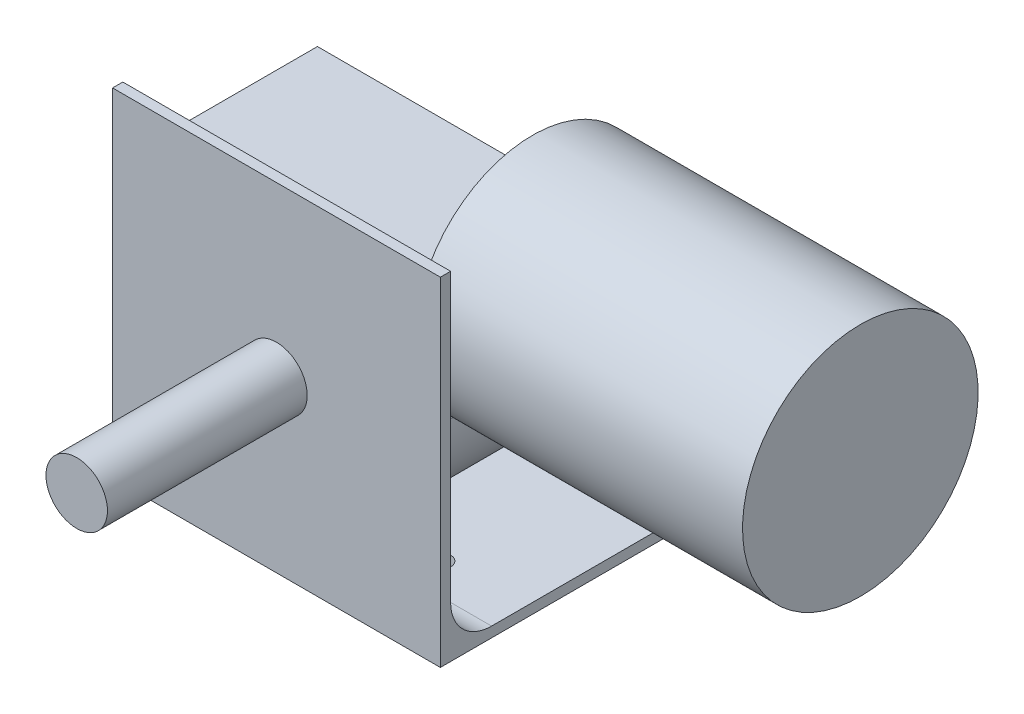
ISO-10303-21;
HEADER;
FILE_DESCRIPTION(('STEP AP214'),'2;1');
FILE_NAME('part.step','',(''),(''),'','','');
FILE_SCHEMA(('AUTOMOTIVE_DESIGN { 1 0 10303 214 1 1 1 1 }'));
ENDSEC;
DATA;
#1=APPLICATION_CONTEXT('core data for automotive mechanical design processes');
#2=APPLICATION_PROTOCOL_DEFINITION('international standard','automotive_design',2000,#1);
#3=PRODUCT_CONTEXT('',#1,'mechanical');
#4=PRODUCT('Part','Part','',(#3));
#5=PRODUCT_RELATED_PRODUCT_CATEGORY('part','',(#4));
#6=PRODUCT_DEFINITION_FORMATION('','',#4);
#7=PRODUCT_DEFINITION_CONTEXT('part definition',#1,'design');
#8=PRODUCT_DEFINITION('design','',#6,#7);
#9=PRODUCT_DEFINITION_SHAPE('','',#8);
#10=(LENGTH_UNIT() NAMED_UNIT(*) SI_UNIT(.MILLI.,.METRE.));
#11=(NAMED_UNIT(*) PLANE_ANGLE_UNIT() SI_UNIT($,.RADIAN.));
#12=(NAMED_UNIT(*) SI_UNIT($,.STERADIAN.) SOLID_ANGLE_UNIT());
#13=UNCERTAINTY_MEASURE_WITH_UNIT(LENGTH_MEASURE(1.E-05),#10,'distance_accuracy_value','');
#14=(GEOMETRIC_REPRESENTATION_CONTEXT(3) GLOBAL_UNCERTAINTY_ASSIGNED_CONTEXT((#13)) GLOBAL_UNIT_ASSIGNED_CONTEXT((#10,
#11,#12)) REPRESENTATION_CONTEXT('',''));
#15=CARTESIAN_POINT('',(0.,0.,0.));
#16=DIRECTION('',(0.,0.,1.));
#17=DIRECTION('',(1.,0.,0.));
#18=AXIS2_PLACEMENT_3D('',#15,#16,#17);
#19=CARTESIAN_POINT('',(38.1,52.3875,0.));
#20=DIRECTION('',(1.,0.,0.));
#21=DIRECTION('',(0.,1.,0.));
#22=AXIS2_PLACEMENT_3D('',#19,#20,#21);
#23=PLANE('',#22);
#24=DIRECTION('',(0.,0.,1.));
#25=VECTOR('',#24,1.);
#26=CARTESIAN_POINT('',(38.1,52.3875,0.));
#27=LINE('',#26,#25);
#28=CARTESIAN_POINT('',(38.1,52.3875,34.1184442484171));
#29=VERTEX_POINT('',#28);
#30=CARTESIAN_POINT('',(38.1,52.3875,47.625));
#31=VERTEX_POINT('',#30);
#32=EDGE_CURVE('E75',#29,#31,#27,.T.);
#33=ORIENTED_EDGE('',*,*,#32,.F.);
#34=CARTESIAN_POINT('',(38.1,79.375,9.52500000000001));
#35=DIRECTION('',(1.,0.,0.));
#36=DIRECTION('',(0.,1.,0.));
#37=AXIS2_PLACEMENT_3D('',#34,#35,#36);
#38=CIRCLE('',#37,36.5125);
#39=CARTESIAN_POINT('',(38.1,96.8375,41.5909281792996));
#40=VERTEX_POINT('',#39);
#41=EDGE_CURVE('E154',#40,#29,#38,.T.);
#42=ORIENTED_EDGE('',*,*,#41,.F.);
#43=DIRECTION('',(0.,0.,1.));
#44=VECTOR('',#43,1.);
#45=CARTESIAN_POINT('',(38.1,96.8375,0.));
#46=LINE('',#45,#44);
#47=CARTESIAN_POINT('',(38.1,96.8375,47.625));
#48=VERTEX_POINT('',#47);
#49=EDGE_CURVE('E183',#40,#48,#46,.T.);
#50=ORIENTED_EDGE('',*,*,#49,.T.);
#51=DIRECTION('',(0.,1.,0.));
#52=VECTOR('',#51,1.);
#53=CARTESIAN_POINT('',(38.1,52.3875,47.625));
#54=LINE('',#53,#52);
#55=EDGE_CURVE('E162',#31,#48,#54,.T.);
#56=ORIENTED_EDGE('',*,*,#55,.F.);
#57=EDGE_LOOP('',(#33,#42,#50,#56));
#58=FACE_BOUND('',#57,.T.);
#59=ADVANCED_FACE('F49',(#58),#23,.T.);
#60=CARTESIAN_POINT('',(-50.8,104.775,47.625));
#61=DIRECTION('',(0.,0.,1.));
#62=DIRECTION('',(1.,0.,0.));
#63=AXIS2_PLACEMENT_3D('',#60,#61,#62);
#64=PLANE('',#63);
#65=CARTESIAN_POINT('',(0.,52.3875,47.625));
#66=DIRECTION('',(0.,0.,-1.));
#67=DIRECTION('',(-1.,0.,0.));
#68=AXIS2_PLACEMENT_3D('',#65,#66,#67);
#69=CIRCLE('',#68,38.1);
#70=CARTESIAN_POINT('',(10.8833516781367,15.875,47.625));
#71=VERTEX_POINT('',#70);
#72=EDGE_CURVE('E173',#31,#71,#69,.T.);
#73=ORIENTED_EDGE('',*,*,#72,.F.);
#74=ORIENTED_EDGE('',*,*,#55,.T.);
#75=DIRECTION('',(-1.,0.,0.));
#76=VECTOR('',#75,1.);
#77=CARTESIAN_POINT('',(38.1,96.8375,47.625));
#78=LINE('',#77,#76);
#79=CARTESIAN_POINT('',(-38.1,96.8375,47.625));
#80=VERTEX_POINT('',#79);
#81=EDGE_CURVE('E187',#48,#80,#78,.T.);
#82=ORIENTED_EDGE('',*,*,#81,.T.);
#83=DIRECTION('',(0.,1.,0.));
#84=VECTOR('',#83,1.);
#85=CARTESIAN_POINT('',(-38.1,52.3875,47.625));
#86=LINE('',#85,#84);
#87=CARTESIAN_POINT('',(-38.1,52.3875,47.625));
#88=VERTEX_POINT('',#87);
#89=EDGE_CURVE('E184',#88,#80,#86,.T.);
#90=ORIENTED_EDGE('',*,*,#89,.F.);
#91=CARTESIAN_POINT('',(-10.8833516781366,15.875,47.625));
#92=VERTEX_POINT('',#91);
#93=EDGE_CURVE('E194',#92,#88,#69,.T.);
#94=ORIENTED_EDGE('',*,*,#93,.F.);
#95=DIRECTION('',(-1.,0.,0.));
#96=VECTOR('',#95,1.);
#97=CARTESIAN_POINT('',(-50.8,15.875,47.625));
#98=LINE('',#97,#96);
#99=CARTESIAN_POINT('',(-50.8,15.875,47.625));
#100=VERTEX_POINT('',#99);
#101=EDGE_CURVE('E259',#92,#100,#98,.T.);
#102=ORIENTED_EDGE('',*,*,#101,.T.);
#103=DIRECTION('',(0.,-1.,0.));
#104=VECTOR('',#103,1.);
#105=CARTESIAN_POINT('',(-50.8,104.775,47.625));
#106=LINE('',#105,#104);
#107=CARTESIAN_POINT('',(-50.8,104.775,47.625));
#108=VERTEX_POINT('',#107);
#109=EDGE_CURVE('E231',#108,#100,#106,.T.);
#110=ORIENTED_EDGE('',*,*,#109,.F.);
#111=DIRECTION('',(-1.,0.,0.));
#112=VECTOR('',#111,1.);
#113=CARTESIAN_POINT('',(-50.8,104.775,47.625));
#114=LINE('',#113,#112);
#115=CARTESIAN_POINT('',(50.8,104.775,47.625));
#116=VERTEX_POINT('',#115);
#117=EDGE_CURVE('E229',#116,#108,#114,.T.);
#118=ORIENTED_EDGE('',*,*,#117,.F.);
#119=DIRECTION('',(0.,-1.,0.));
#120=VECTOR('',#119,1.);
#121=CARTESIAN_POINT('',(50.8,104.775,47.625));
#122=LINE('',#121,#120);
#123=CARTESIAN_POINT('',(50.8,15.875,47.625));
#124=VERTEX_POINT('',#123);
#125=EDGE_CURVE('E247',#116,#124,#122,.T.);
#126=ORIENTED_EDGE('',*,*,#125,.T.);
#127=EDGE_CURVE('E255',#124,#71,#98,.T.);
#128=ORIENTED_EDGE('',*,*,#127,.T.);
#129=EDGE_LOOP('',(#73,#74,#82,#90,#94,#102,#110,#118,#126,#128));
#130=FACE_BOUND('',#129,.T.);
#131=ADVANCED_FACE('F282',(#130),#64,.F.);
#132=CARTESIAN_POINT('',(-50.8,15.875,34.925));
#133=DIRECTION('',(-1.,0.,0.));
#134=DIRECTION('',(0.,0.,1.));
#135=AXIS2_PLACEMENT_3D('',#132,#133,#134);
#136=CYLINDRICAL_SURFACE('',#135,12.7);
#137=CARTESIAN_POINT('',(10.8833516781367,15.875,47.625));
#138=CARTESIAN_POINT('',(10.3730525428204,15.7228946163432,47.6250016366047));
#139=CARTESIAN_POINT('',(9.85953509828765,15.5814803263617,47.6222802820452));
#140=CARTESIAN_POINT('',(8.8269947183021,15.3202931065714,47.6135526113099));
#141=CARTESIAN_POINT('',(8.30797097151665,15.2005234142494,47.6075458042533));
#142=CARTESIAN_POINT('',(7.26509560923538,14.9827907398067,47.5940911343711));
#143=CARTESIAN_POINT('',(6.7412415672725,14.8848394180847,47.586642504947));
#144=CARTESIAN_POINT('',(5.68990770627986,14.7109977258499,47.5718458416427));
#145=CARTESIAN_POINT('',(5.16242803695867,14.6351064499741,47.564497803646));
#146=CARTESIAN_POINT('',(4.10347894465887,14.5053579899575,47.5510978591837));
#147=CARTESIAN_POINT('',(3.57200302976457,14.4515534378577,47.5450490649297));
#148=CARTESIAN_POINT('',(2.5072325732708,14.3663343574066,47.5351455046628));
#149=CARTESIAN_POINT('',(1.97393801337232,14.3349200550155,47.5312907607921));
#150=CARTESIAN_POINT('',(0.906599596275883,14.2945449275413,47.52629264782));
#151=CARTESIAN_POINT('',(0.372555922025923,14.2855793407752,47.5251487037232));
#152=CARTESIAN_POINT('',(-0.695432963041855,14.2901047146811,47.5257187076317));
#153=CARTESIAN_POINT('',(-1.22937817416053,14.3035956055596,47.5274326467548));
#154=CARTESIAN_POINT('',(-2.29691666349038,14.3530410041654,47.5334995639886));
#155=CARTESIAN_POINT('',(-2.83050855212299,14.3890250725765,47.5378560146822));
#156=CARTESIAN_POINT('',(-3.89568552753107,14.4834169125394,47.5486187762102));
#157=CARTESIAN_POINT('',(-4.42727060643122,14.5418247719967,47.5550250950806));
#158=CARTESIAN_POINT('',(-5.48761251512766,14.6809741171146,47.5689388711745));
#159=CARTESIAN_POINT('',(-6.01636870172657,14.7617204787607,47.5764465686355));
#160=CARTESIAN_POINT('',(-7.07001300902832,14.9453994811022,47.5912674107498));
#161=CARTESIAN_POINT('',(-7.59490115271145,15.0483319898782,47.5985805565596));
#162=CARTESIAN_POINT('',(-8.63954456099684,15.2761289086062,47.6113847091505));
#163=CARTESIAN_POINT('',(-9.15930309499015,15.40097824861,47.6168769605256));
#164=CARTESIAN_POINT('',(-10.1931507672481,15.6724442274982,47.6241104730915));
#165=CARTESIAN_POINT('',(-10.7072397417456,15.8190614933963,47.6258516262115));
#166=CARTESIAN_POINT('',(-11.7285837846019,16.1337315724601,47.6233388131038));
#167=CARTESIAN_POINT('',(-12.235841556336,16.3017756130999,47.6190872932669));
#168=CARTESIAN_POINT('',(-13.2426638993691,16.6589795622064,47.6020394438277));
#169=CARTESIAN_POINT('',(-13.7422292392319,16.8481373453806,47.5892439736079));
#170=CARTESIAN_POINT('',(-14.8658341301256,17.3008103806973,47.5472740423023));
#171=CARTESIAN_POINT('',(-15.4872230661125,17.5706429692637,47.5146205046702));
#172=CARTESIAN_POINT('',(-16.7133018432464,18.1423110462305,47.4243211924508));
#173=CARTESIAN_POINT('',(-17.317992085383,18.4441457653129,47.3666760185496));
#174=CARTESIAN_POINT('',(-18.5064646498756,19.0772424273994,47.2189476554986));
#175=CARTESIAN_POINT('',(-19.0902809995024,19.4084530978861,47.1289201782385));
#176=CARTESIAN_POINT('',(-20.2339582174904,20.0975327343201,46.9079498934892));
#177=CARTESIAN_POINT('',(-20.7938279453918,20.4553917044973,46.7770223693032));
#178=CARTESIAN_POINT('',(-21.7172937948834,21.0797082223941,46.5128364924578));
#179=CARTESIAN_POINT('',(-22.0884338345003,21.3405461009487,46.3926025725637));
#180=CARTESIAN_POINT('',(-22.8147980060793,21.8703428417145,46.1247312945663));
#181=CARTESIAN_POINT('',(-23.1700225169978,22.1393015103101,45.9770945893677));
#182=CARTESIAN_POINT('',(-23.8618461705317,22.682021972767,45.6513466429108));
#183=CARTESIAN_POINT('',(-24.1984627352639,22.9557789465313,45.4732645689894));
#184=CARTESIAN_POINT('',(-24.8507197223003,23.504405608862,45.0835089705245));
#185=CARTESIAN_POINT('',(-25.1663658135775,23.7792749752221,44.8718445771827));
#186=CARTESIAN_POINT('',(-25.7038371749709,24.2623911305154,44.4652885423789));
#187=CARTESIAN_POINT('',(-25.9305367039214,24.4714125468909,44.2777469576156));
#188=CARTESIAN_POINT('',(-26.368341258711,24.8845711871538,43.8804298162096));
#189=CARTESIAN_POINT('',(-26.5794497735499,25.0887094968406,43.6706592597672));
#190=CARTESIAN_POINT('',(-26.9845090850279,25.4890367775657,43.2285627249006));
#191=CARTESIAN_POINT('',(-27.1784722876557,25.685231439818,42.996253314704));
#192=CARTESIAN_POINT('',(-27.5479675860322,26.0665964675476,42.5089975738468));
#193=CARTESIAN_POINT('',(-27.7235022135489,26.2517683458477,42.2540543615852));
#194=CARTESIAN_POINT('',(-28.0301502542058,26.5812301066569,41.7617294351516));
#195=CARTESIAN_POINT('',(-28.1639882475115,26.7275056143007,41.527369707858));
#196=CARTESIAN_POINT('',(-28.4165439314505,27.0074769643903,41.043500585764));
#197=CARTESIAN_POINT('',(-28.5352642253795,27.1411749716663,40.7939938102708));
#198=CARTESIAN_POINT('',(-28.7569092291271,27.3939319068551,40.2809295540399));
#199=CARTESIAN_POINT('',(-28.8598343521675,27.5129912177187,40.0173724411199));
#200=CARTESIAN_POINT('',(-29.0493028062014,27.7345231446831,39.4776687090642));
#201=CARTESIAN_POINT('',(-29.1358458526025,27.8369954726275,39.2015218713209));
#202=CARTESIAN_POINT('',(-29.2923896505595,28.0239851013214,38.6372588409612));
#203=CARTESIAN_POINT('',(-29.3623190829347,28.1084248402163,38.3490970724196));
#204=CARTESIAN_POINT('',(-29.4847795081061,28.2572889904582,37.7640197719495));
#205=CARTESIAN_POINT('',(-29.5373102703151,28.3217131365349,37.4671041240614));
#206=CARTESIAN_POINT('',(-29.6246876047836,28.429355251988,36.8669319411584));
#207=CARTESIAN_POINT('',(-29.6595367220296,28.4725762731813,36.5636763252254));
#208=CARTESIAN_POINT('',(-29.7113815698908,28.5370171946115,35.9533328318951));
#209=CARTESIAN_POINT('',(-29.7283785268348,28.5582386060793,35.646245219198));
#210=CARTESIAN_POINT('',(-29.7438142139887,28.5775097704797,35.0548417420662));
#211=CARTESIAN_POINT('',(-29.7435941186308,28.577234108641,34.7706133403252));
#212=CARTESIAN_POINT('',(-29.7279068604518,28.5576507435448,34.2032468062718));
#213=CARTESIAN_POINT('',(-29.7124406144488,28.538344184699,33.9201086094284));
#214=CARTESIAN_POINT('',(-29.6663328152946,28.4810146199157,33.3570514022969));
#215=CARTESIAN_POINT('',(-29.6356946781381,28.4429958271031,33.0771316818693));
#216=CARTESIAN_POINT('',(-29.5593773114501,28.348846167681,32.522438985901));
#217=CARTESIAN_POINT('',(-29.5136979440895,28.2927151351016,32.2476660575468));
#218=CARTESIAN_POINT('',(-29.4081810516941,28.1640463098143,31.7086125884212));
#219=CARTESIAN_POINT('',(-29.3485316129668,28.091726995788,31.4442429047399));
#220=CARTESIAN_POINT('',(-29.2150431075463,27.93137339036,30.9240061207932));
#221=CARTESIAN_POINT('',(-29.1412043300546,27.8433394192508,30.6681388473596));
#222=CARTESIAN_POINT('',(-28.9796781947985,27.6528313076042,30.166353634413));
#223=CARTESIAN_POINT('',(-28.8919905906859,27.5503569101983,29.9204358719835));
#224=CARTESIAN_POINT('',(-28.7031843995679,27.3324010291058,29.4397829042502));
#225=CARTESIAN_POINT('',(-28.6020652653354,27.2169190154924,29.205048155094));
#226=CARTESIAN_POINT('',(-28.3807346376528,26.9675621176647,28.7346926341535));
#227=CARTESIAN_POINT('',(-28.2597624240299,26.833013356279,28.4997874144165));
#228=CARTESIAN_POINT('',(-28.0040142102013,26.5530049564194,28.0444727875199));
#229=CARTESIAN_POINT('',(-27.8692380631154,26.407545201852,27.8240635346452));
#230=CARTESIAN_POINT('',(-27.5865607428826,26.1075812907935,27.3982393879794));
#231=CARTESIAN_POINT('',(-27.4386559550049,25.9530746474175,27.1928286523059));
#232=CARTESIAN_POINT('',(-27.1305092816455,25.6369067345854,26.7973119921943));
#233=CARTESIAN_POINT('',(-26.9702649428988,25.4752440451435,26.6072091266105));
#234=CARTESIAN_POINT('',(-26.5685840103988,25.077609753077,26.1658102745895));
#235=CARTESIAN_POINT('',(-26.3212779427126,24.8389044504871,25.9222812082784));
#236=CARTESIAN_POINT('',(-25.8056928248145,24.3553532129654,25.4653821394871));
#237=CARTESIAN_POINT('',(-25.5374068029808,24.1105052553488,25.252022228899));
#238=CARTESIAN_POINT('',(-24.9817291236716,23.6184001772561,24.8537487052443));
#239=CARTESIAN_POINT('',(-24.6943099371872,23.3711400422389,24.6688774065285));
#240=CARTESIAN_POINT('',(-24.1028550710235,22.8779965538643,24.3260263824997));
#241=CARTESIAN_POINT('',(-23.7988188944759,22.6321132419183,24.1680474618836));
#242=CARTESIAN_POINT('',(-23.0353345728784,22.0343713972232,23.8109460149007));
#243=CARTESIAN_POINT('',(-22.5676992394588,21.6847917016249,23.6254539430874));
#244=CARTESIAN_POINT('',(-21.6064165641853,21.000857412258,23.2991981086429));
#245=CARTESIAN_POINT('',(-21.1127572459644,20.6665099627442,23.1584551530049));
#246=CARTESIAN_POINT('',(-20.102808441344,20.0170152020197,22.9144102745402));
#247=CARTESIAN_POINT('',(-19.5864783330365,19.7019049935422,22.8111789129952));
#248=CARTESIAN_POINT('',(-18.5354879121502,19.0946463311703,22.6358271224434));
#249=CARTESIAN_POINT('',(-18.0008279846067,18.8024973953765,22.5637060403674));
#250=CARTESIAN_POINT('',(-17.0354995494527,18.3048313004175,22.4576203711614));
#251=CARTESIAN_POINT('',(-16.6078686286682,18.0944073540089,22.4187501564876));
#252=CARTESIAN_POINT('',(-15.7441773195879,17.6893966644892,22.3536019246121));
#253=CARTESIAN_POINT('',(-15.3081159821937,17.4948117175367,22.3273253338933));
#254=CARTESIAN_POINT('',(-14.4283819904912,17.1219336833544,22.2849693264922));
#255=CARTESIAN_POINT('',(-13.9847059612757,16.9436480538471,22.2688945578452));
#256=CARTESIAN_POINT('',(-13.090789575051,16.6038464341503,22.2447873677833));
#257=CARTESIAN_POINT('',(-12.6405494244422,16.4423299179688,22.2367546940458));
#258=CARTESIAN_POINT('',(-11.733980457512,16.1362553987126,22.2267637383886));
#259=CARTESIAN_POINT('',(-11.2776481306725,15.9917076888995,22.2248091252803));
#260=CARTESIAN_POINT('',(-10.3598656028629,15.7199088729438,22.225219876473));
#261=CARTESIAN_POINT('',(-9.89841537430601,15.5926578600836,22.2275852640712));
#262=CARTESIAN_POINT('',(-8.97115328493669,15.3556574072211,22.2350694313573));
#263=CARTESIAN_POINT('',(-8.50534220425057,15.245904897887,22.2401877274799));
#264=CARTESIAN_POINT('',(-7.5699340567917,15.0440261746347,22.2518115877848));
#265=CARTESIAN_POINT('',(-7.100336978788,14.9519000130243,22.2583171560839));
#266=CARTESIAN_POINT('',(-6.13923498503407,14.7820838875485,22.2718153349685));
#267=CARTESIAN_POINT('',(-5.64760259144798,14.705115250178,22.2788170235669));
#268=CARTESIAN_POINT('',(-4.66168743444022,14.5704904531646,22.2919944438696));
#269=CARTESIAN_POINT('',(-4.16740465602381,14.5128344029015,22.2981701708959));
#270=CARTESIAN_POINT('',(-3.17692237308303,14.4169227634852,22.3088856593051));
#271=CARTESIAN_POINT('',(-2.68072279520333,14.3786679243724,22.3134253574382));
#272=CARTESIAN_POINT('',(-1.68719109902325,14.3216232151093,22.3203244085103));
#273=CARTESIAN_POINT('',(-1.18985898234729,14.3028333170578,22.3226837645746));
#274=CARTESIAN_POINT('',(-0.194602302821954,14.2847447092116,22.3249535037186));
#275=CARTESIAN_POINT('',(0.303322428201127,14.2854551004184,22.324862743302));
#276=CARTESIAN_POINT('',(1.29875362675905,14.3063882813755,22.3222396698089));
#277=CARTESIAN_POINT('',(1.79626009519026,14.3266110292024,22.3197073619783));
#278=CARTESIAN_POINT('',(2.79007543755734,14.3865356776971,22.3124909480213));
#279=CARTESIAN_POINT('',(3.28638432906831,14.4262372907331,22.3078068736686));
#280=CARTESIAN_POINT('',(4.27705063494961,14.525056313805,22.2968521202755));
#281=CARTESIAN_POINT('',(4.77140802683799,14.5841739468634,22.2905814230104));
#282=CARTESIAN_POINT('',(5.79369595483374,14.7267954292664,22.2767929819547));
#283=CARTESIAN_POINT('',(6.32142063318491,14.8117734367116,22.2692174325338));
#284=CARTESIAN_POINT('',(7.37284203927316,15.0038564361455,22.254546917231));
#285=CARTESIAN_POINT('',(7.89653869403408,15.1109618280438,22.2474519600381));
#286=CARTESIAN_POINT('',(8.93917336218515,15.3471571852422,22.2354227879585));
#287=CARTESIAN_POINT('',(9.45810963033803,15.4762548985173,22.2304893367737));
#288=CARTESIAN_POINT('',(10.4901079082341,15.7561817994467,22.2247842770524));
#289=CARTESIAN_POINT('',(11.0031700059996,15.9070106610066,22.2240126060716));
#290=CARTESIAN_POINT('',(12.021592031571,16.2298427905444,22.2289335395517));
#291=CARTESIAN_POINT('',(12.5269637342619,16.4018090278118,22.2346149787401));
#292=CARTESIAN_POINT('',(13.5299158056275,16.7667734620013,22.2550296664939));
#293=CARTESIAN_POINT('',(14.0274957627658,16.9597727655697,22.2697633915311));
#294=CARTESIAN_POINT('',(15.0133391956646,17.3661682974446,22.311193736664));
#295=CARTESIAN_POINT('',(15.5016093372109,17.5795492200846,22.3378814345809));
#296=CARTESIAN_POINT('',(16.4678324986146,18.0261310729564,22.4064672199232));
#297=CARTESIAN_POINT('',(16.9457874179778,18.2593283143629,22.448362481177));
#298=CARTESIAN_POINT('',(17.9056542576693,18.7527222195507,22.5526759110462));
#299=CARTESIAN_POINT('',(18.3871704128844,19.0135583559743,22.615729463649));
#300=CARTESIAN_POINT('',(19.3356682334525,19.5539840242579,22.7663095281666));
#301=CARTESIAN_POINT('',(19.8026508871498,19.8335722767909,22.8538343718629));
#302=CARTESIAN_POINT('',(20.7192215521623,20.4091268621025,23.0580357632112));
#303=CARTESIAN_POINT('',(21.1688276982473,20.7050752910489,23.1746809160514));
#304=CARTESIAN_POINT('',(22.0482321516221,21.310656564396,23.4422661309816));
#305=CARTESIAN_POINT('',(22.4780346243223,21.6202865040044,23.5931989411954));
#306=CARTESIAN_POINT('',(23.2262370387537,22.1828215531666,23.8986193059496));
#307=CARTESIAN_POINT('',(23.5490276000714,22.4339316293092,24.0456562965478));
#308=CARTESIAN_POINT('',(24.1781937961098,22.9394493876776,24.3669117288334));
#309=CARTESIAN_POINT('',(24.4845696428252,23.1938570272629,24.5411298193653));
#310=CARTESIAN_POINT('',(25.0783699118616,23.7023470035338,24.9188602837643));
#311=CARTESIAN_POINT('',(25.3658146692235,23.9564293920099,25.1223404517156));
#312=CARTESIAN_POINT('',(25.9196960301918,24.4604621198608,25.5606376774733));
#313=CARTESIAN_POINT('',(26.1861381019554,24.7104135212762,25.7954465355407));
#314=CARTESIAN_POINT('',(26.6385753307131,25.146503644106,26.2414767588601));
#315=CARTESIAN_POINT('',(26.8292403866832,25.3344181140296,26.4462394233598));
#316=CARTESIAN_POINT('',(27.1952200986937,25.7023490410468,26.8755842486569));
#317=CARTESIAN_POINT('',(27.3705382287168,25.882367280931,27.1001619008341));
#318=CARTESIAN_POINT('',(27.7046910901647,26.231839756285,27.5689596085419));
#319=CARTESIAN_POINT('',(27.8635269100309,26.4012946890279,27.813178365141));
#320=CARTESIAN_POINT('',(28.1636440040991,26.7268649490747,28.320616237994));
#321=CARTESIAN_POINT('',(28.3049249584295,26.8829800332937,28.5838357003265));
#322=CARTESIAN_POINT('',(28.5699166712127,27.1801634421962,29.1301174444217));
#323=CARTESIAN_POINT('',(28.6934895363206,27.3211117507401,29.413312260537));
#324=CARTESIAN_POINT('',(28.9209343819008,27.5838756506844,29.9960671429888));
#325=CARTESIAN_POINT('',(29.0248058740115,27.7056907677946,30.2956276147636));
#326=CARTESIAN_POINT('',(29.2120844181671,27.9276302918257,30.908739083989));
#327=CARTESIAN_POINT('',(29.2954990270548,28.0277627068065,31.2222848644791));
#328=CARTESIAN_POINT('',(29.4413428078611,28.2042315015768,31.8607394748225));
#329=CARTESIAN_POINT('',(29.5037748625836,28.280571150162,32.1856467369383));
#330=CARTESIAN_POINT('',(29.6008898872263,28.3999518978036,32.8032105594058));
#331=CARTESIAN_POINT('',(29.6380421595838,28.445934595615,33.094915740574));
#332=CARTESIAN_POINT('',(29.6957348391736,28.5175301115257,33.6824310953872));
#333=CARTESIAN_POINT('',(29.7162767510368,28.543144774637,33.9782408947503));
#334=CARTESIAN_POINT('',(29.7406505546787,28.5735527444408,34.5715064449592));
#335=CARTESIAN_POINT('',(29.7444883731782,28.5783534360631,34.8689615745182));
#336=CARTESIAN_POINT('',(29.7354526071589,28.5670693981819,35.4632199995237));
#337=CARTESIAN_POINT('',(29.7225793760821,28.5509851103998,35.7600233086233));
#338=CARTESIAN_POINT('',(29.6814274982395,28.4997655636252,36.3332588973246));
#339=CARTESIAN_POINT('',(29.6540962546571,28.4658024685544,36.6098653336873));
#340=CARTESIAN_POINT('',(29.584796658873,28.3801503222416,37.1584447003581));
#341=CARTESIAN_POINT('',(29.5428290986455,28.3284622301055,37.4304178805375));
#342=CARTESIAN_POINT('',(29.4444437429485,28.2081542696775,37.9678829848321));
#343=CARTESIAN_POINT('',(29.3880277355125,28.1395364965169,38.2333757064714));
#344=CARTESIAN_POINT('',(29.2609933252545,27.9863902480016,38.7562458063395));
#345=CARTESIAN_POINT('',(29.1903745392569,27.9018613433855,39.0136229654024));
#346=CARTESIAN_POINT('',(29.0338163270977,27.7164137601009,39.5234633470638));
#347=CARTESIAN_POINT('',(28.9476163933362,27.6152195013747,39.775746156812));
#348=CARTESIAN_POINT('',(28.7612421548644,27.3990766745457,40.2689840230046));
#349=CARTESIAN_POINT('',(28.6610678247168,27.2841280814065,40.5099390588284));
#350=CARTESIAN_POINT('',(28.4472315347753,27.04206475466,40.9794559869076));
#351=CARTESIAN_POINT('',(28.3335679463638,26.914948552363,41.2080163778395));
#352=CARTESIAN_POINT('',(28.093323267471,26.6502286794142,41.6519045424191));
#353=CARTESIAN_POINT('',(27.9667406362438,26.5126237583575,41.8672307328167));
#354=CARTESIAN_POINT('',(27.6892494191156,26.2157521670548,42.302974078685));
#355=CARTESIAN_POINT('',(27.5371758033065,26.0556527733662,42.5220816913677));
#356=CARTESIAN_POINT('',(27.2192979748345,25.7271913978017,42.9434603874971));
#357=CARTESIAN_POINT('',(27.0534932908903,25.5588291324064,43.1457308925783));
#358=CARTESIAN_POINT('',(26.7090327140247,25.2158857042777,43.533417198451));
#359=CARTESIAN_POINT('',(26.5303743032902,25.041303326536,43.7188296808704));
#360=CARTESIAN_POINT('',(26.1611496878074,24.6878675896366,44.0730044834517));
#361=CARTESIAN_POINT('',(25.9705811208454,24.5090133875958,44.2417634834006));
#362=CARTESIAN_POINT('',(25.4739878269713,24.052854606499,44.6486567507258));
#363=CARTESIAN_POINT('',(25.1605260099212,23.7738471669051,44.875872599013));
#364=CARTESIAN_POINT('',(24.5109195230426,23.2154495938409,45.2946548151243));
#365=CARTESIAN_POINT('',(24.1747650239051,22.9360593465593,45.4862055979051));
#366=CARTESIAN_POINT('',(23.4819427639785,22.3807351308049,45.8370821847944));
#367=CARTESIAN_POINT('',(23.1252287369425,22.1048108064916,45.9963313484465));
#368=CARTESIAN_POINT('',(22.3946038069693,21.5605758321606,46.285422066114));
#369=CARTESIAN_POINT('',(22.0206932586072,21.2922650253441,46.4152642261454));
#370=CARTESIAN_POINT('',(21.3485135028371,20.8284139081035,46.6212340382754));
#371=CARTESIAN_POINT('',(21.053363511291,20.630721334339,46.702795511582));
#372=CARTESIAN_POINT('',(20.4552032049999,20.2421747161279,46.8523256154622));
#373=CARTESIAN_POINT('',(20.1521919965037,20.0513214551769,46.9202926927539));
#374=CARTESIAN_POINT('',(19.2322783590717,19.4900060315912,47.1060247393363));
#375=CARTESIAN_POINT('',(18.6046670957143,19.1309066431334,47.2055700581647));
#376=CARTESIAN_POINT('',(17.3264891135262,18.4474266732266,47.3666978547813));
#377=CARTESIAN_POINT('',(16.6759238357174,18.1230439174529,47.4282827112085));
#378=CARTESIAN_POINT('',(15.3558846555011,17.511495822965,47.5229194716809));
#379=CARTESIAN_POINT('',(14.6864181754162,17.2243161158866,47.5559824193939));
#380=CARTESIAN_POINT('',(13.4962320913766,16.7537245797192,47.5961944624635));
#381=CARTESIAN_POINT('',(12.9788918804242,16.5620535250864,47.6076879307275));
#382=CARTESIAN_POINT('',(12.197142461252,16.2915765784174,47.6184857667799));
#383=CARTESIAN_POINT('',(11.9356890069573,16.2042815649759,47.6210115431653));
#384=CARTESIAN_POINT('',(11.4108953675509,16.0353684458814,47.6242683896675));
#385=CARTESIAN_POINT('',(11.147554867299,15.9537513140228,47.6249991526614));
#386=CARTESIAN_POINT('',(10.8833516781367,15.875,47.625));
#387=B_SPLINE_CURVE_WITH_KNOTS('',3,(#137,#138,#139,#140,#141,#142,#143,#144,#145,#146,#147,
#148,#149,#150,#151,#152,#153,#154,#155,#156,#157,#158,#159,#160,#161,#162,#163,#164,#165,#166,
#167,#168,#169,#170,#171,#172,#173,#174,#175,#176,#177,#178,#179,#180,#181,#182,#183,#184,#185,
#186,#187,#188,#189,#190,#191,#192,#193,#194,#195,#196,#197,#198,#199,#200,#201,#202,#203,#204,
#205,#206,#207,#208,#209,#210,#211,#212,#213,#214,#215,#216,#217,#218,#219,#220,#221,#222,#223,
#224,#225,#226,#227,#228,#229,#230,#231,#232,#233,#234,#235,#236,#237,#238,#239,#240,#241,#242,
#243,#244,#245,#246,#247,#248,#249,#250,#251,#252,#253,#254,#255,#256,#257,#258,#259,#260,#261,
#262,#263,#264,#265,#266,#267,#268,#269,#270,#271,#272,#273,#274,#275,#276,#277,#278,#279,#280,
#281,#282,#283,#284,#285,#286,#287,#288,#289,#290,#291,#292,#293,#294,#295,#296,#297,#298,#299,
#300,#301,#302,#303,#304,#305,#306,#307,#308,#309,#310,#311,#312,#313,#314,#315,#316,#317,#318,
#319,#320,#321,#322,#323,#324,#325,#326,#327,#328,#329,#330,#331,#332,#333,#334,#335,#336,#337,
#338,#339,#340,#341,#342,#343,#344,#345,#346,#347,#348,#349,#350,#351,#352,#353,#354,#355,#356,
#357,#358,#359,#360,#361,#362,#363,#364,#365,#366,#367,#368,#369,#370,#371,#372,#373,#374,#375,
#376,#377,#378,#379,#380,#381,#382,#383,#384,#385,#386),.UNSPECIFIED.,.T.,.F.,(4,2,2,2,2,2,2,2,
2,2,2,2,2,2,2,2,2,2,2,2,2,2,2,2,2,2,2,2,2,2,2,2,2,2,2,2,2,2,2,2,2,2,2,2,2,2,2,2,2,2,2,2,2,2,2,2,
2,2,2,2,2,2,2,2,2,2,2,2,2,2,2,2,2,2,2,2,2,2,2,2,2,2,2,2,2,2,2,2,2,2,2,2,2,2,2,2,2,2,2,2,2,2,2,2,
2,2,2,2,2,2,2,2,2,2,2,2,2,2,2,2,2,2,2,2,4),(0.,1.59739237906854,3.19502349041154,
4.79350638655653,6.39192367034837,7.99412813028952,9.59634875928367,11.1982295063295,
12.8001052748361,14.4040906780435,16.0080823692419,17.6124244518494,19.2167569952551,
20.8199906946269,22.4232705832776,24.0258961540169,25.6283605509768,27.6617226730794,
29.6950359250575,31.7248675807259,33.753941645611,35.1608488638051,36.5677225650277,
37.9732559264354,39.3784077691468,40.4601874434449,41.5417242959384,42.6224720531157,
43.7030711393774,44.6230564550166,45.5428831326282,46.4626857423001,47.3825043294761,
48.306202927043,49.2299137660384,50.1534916140709,51.0770060140785,51.9286579793894,
52.7802587342346,53.631667835844,54.4830847394857,55.3236380740114,56.164174278524,
57.0047254365042,57.8453108507028,58.7339200305247,59.6225386665381,60.5114027308583,
61.4004439715827,62.6622849803825,63.9245470944203,65.1886663507436,66.4528234264857,
68.28777773388,70.1235839963335,71.9628258461865,73.8020290846696,75.2360735615535,
76.6702804346464,78.1051402761532,79.5399550972079,80.9756358267217,82.4113242986703,
83.8467606654145,85.2822012918715,86.7748274586594,88.2674620790244,89.7601543994431,
91.2528445802133,92.7462314278997,94.2396150669645,95.7329766548609,97.2263553968876,
98.8296059170872,100.432885415464,102.036730927634,103.640552375257,105.241603087428,
106.842738078941,108.442680005193,110.042324750548,111.695095924149,113.34775445509,
114.998638879984,116.6491744656,117.951917770242,119.254644246003,120.555947757711,
121.856911341584,122.867089187021,123.877037770615,124.886919617786,125.896819863564,
126.914200425839,127.931606203856,128.948635580663,129.965525170102,130.85727991192,
131.748953866081,132.64031142273,133.531650127303,134.370733214955,135.209770906686,
136.048704815414,136.887661360711,137.742220843338,138.596781881512,139.451446199769,
140.306212566042,141.238504091982,142.170827629541,143.103334292291,144.036026495322,
145.465445578544,146.895487835733,148.328884385574,149.762251393461,150.855290158981,
151.948453742745,154.13542107278,156.322251351411,158.508234509979,160.163103509381,
160.989998833262,161.817035627341),.UNSPECIFIED.);
#388=EDGE_CURVE('E12',#71,#92,#387,.T.);
#389=ORIENTED_EDGE('',*,*,#388,.F.);
#390=ORIENTED_EDGE('',*,*,#127,.F.);
#391=CARTESIAN_POINT('',(50.8,15.875,34.925));
#392=DIRECTION('',(-1.,0.,0.));
#393=DIRECTION('',(0.,0.,1.));
#394=AXIS2_PLACEMENT_3D('',#391,#392,#393);
#395=CIRCLE('',#394,12.7);
#396=CARTESIAN_POINT('',(50.8,3.175,34.925));
#397=VERTEX_POINT('',#396);
#398=EDGE_CURVE('E265',#397,#124,#395,.T.);
#399=ORIENTED_EDGE('',*,*,#398,.F.);
#400=DIRECTION('',(-1.,0.,0.));
#401=VECTOR('',#400,1.);
#402=CARTESIAN_POINT('',(-50.8,3.175,34.925));
#403=LINE('',#402,#401);
#404=CARTESIAN_POINT('',(-50.8,3.175,34.925));
#405=VERTEX_POINT('',#404);
#406=EDGE_CURVE('E258',#405,#397,#403,.F.);
#407=ORIENTED_EDGE('',*,*,#406,.F.);
#408=CARTESIAN_POINT('',(-50.8,15.875,34.925));
#409=DIRECTION('',(1.,0.,0.));
#410=DIRECTION('',(0.,0.,-1.));
#411=AXIS2_PLACEMENT_3D('',#408,#409,#410);
#412=CIRCLE('',#411,12.7);
#413=EDGE_CURVE('E263',#100,#405,#412,.T.);
#414=ORIENTED_EDGE('',*,*,#413,.F.);
#415=ORIENTED_EDGE('',*,*,#101,.F.);
#416=EDGE_LOOP('',(#389,#390,#399,#407,#414,#415));
#417=FACE_BOUND('',#416,.T.);
#418=ADVANCED_FACE('F51',(#417),#136,.F.);
#419=CARTESIAN_POINT('',(-50.8,3.175,50.8));
#420=DIRECTION('',(0.,0.,-1.));
#421=DIRECTION('',(-1.,0.,0.));
#422=AXIS2_PLACEMENT_3D('',#419,#420,#421);
#423=PLANE('',#422);
#424=DIRECTION('',(1.,0.,0.));
#425=VECTOR('',#424,1.);
#426=CARTESIAN_POINT('',(-50.8,0.,50.8));
#427=LINE('',#426,#425);
#428=CARTESIAN_POINT('',(-50.8,0.,50.8));
#429=VERTEX_POINT('',#428);
#430=CARTESIAN_POINT('',(50.8,0.,50.8));
#431=VERTEX_POINT('',#430);
#432=EDGE_CURVE('E358',#429,#431,#427,.T.);
#433=ORIENTED_EDGE('',*,*,#432,.T.);
#434=DIRECTION('',(0.,-1.,0.));
#435=VECTOR('',#434,1.);
#436=CARTESIAN_POINT('',(50.8,3.175,50.8));
#437=LINE('',#436,#435);
#438=CARTESIAN_POINT('',(50.8,104.775,50.8));
#439=VERTEX_POINT('',#438);
#440=EDGE_CURVE('E355',#439,#431,#437,.T.);
#441=ORIENTED_EDGE('',*,*,#440,.F.);
#442=DIRECTION('',(1.,0.,0.));
#443=VECTOR('',#442,1.);
#444=CARTESIAN_POINT('',(-50.8,104.775,50.8));
#445=LINE('',#444,#443);
#446=CARTESIAN_POINT('',(-50.8,104.775,50.8));
#447=VERTEX_POINT('',#446);
#448=EDGE_CURVE('E224',#447,#439,#445,.T.);
#449=ORIENTED_EDGE('',*,*,#448,.F.);
#450=DIRECTION('',(0.,-1.,0.));
#451=VECTOR('',#450,1.);
#452=CARTESIAN_POINT('',(-50.8,3.175,50.8));
#453=LINE('',#452,#451);
#454=EDGE_CURVE('E243',#447,#429,#453,.T.);
#455=ORIENTED_EDGE('',*,*,#454,.T.);
#456=EDGE_LOOP('',(#433,#441,#449,#455));
#457=FACE_BOUND('',#456,.T.);
#458=CARTESIAN_POINT('',(0.,52.3875,50.8));
#459=DIRECTION('',(0.,0.,-1.));
#460=DIRECTION('',(-1.,0.,0.));
#461=AXIS2_PLACEMENT_3D('',#458,#459,#460);
#462=CIRCLE('',#461,9.525);
#463=CARTESIAN_POINT('',(-9.525,52.3875,50.8));
#464=VERTEX_POINT('',#463);
#465=EDGE_CURVE('E61',#464,#464,#462,.F.);
#466=ORIENTED_EDGE('',*,*,#465,.F.);
#467=EDGE_LOOP('',(#466));
#468=FACE_BOUND('',#467,.T.);
#469=ADVANCED_FACE('F271',(#457,#468),#423,.F.);
#470=CARTESIAN_POINT('',(-50.8,3.175,-50.8));
#471=DIRECTION('',(1.,0.,0.));
#472=DIRECTION('',(0.,0.,-1.));
#473=AXIS2_PLACEMENT_3D('',#470,#471,#472);
#474=PLANE('',#473);
#475=DIRECTION('',(0.,0.,1.));
#476=VECTOR('',#475,1.);
#477=CARTESIAN_POINT('',(-50.8,0.,-50.8));
#478=LINE('',#477,#476);
#479=CARTESIAN_POINT('',(-50.8,0.,-50.8));
#480=VERTEX_POINT('',#479);
#481=EDGE_CURVE('E252',#480,#429,#478,.T.);
#482=ORIENTED_EDGE('',*,*,#481,.T.);
#483=ORIENTED_EDGE('',*,*,#454,.F.);
#484=DIRECTION('',(0.,0.,1.));
#485=VECTOR('',#484,1.);
#486=CARTESIAN_POINT('',(-50.8,104.775,50.8));
#487=LINE('',#486,#485);
#488=EDGE_CURVE('E221',#108,#447,#487,.T.);
#489=ORIENTED_EDGE('',*,*,#488,.F.);
#490=ORIENTED_EDGE('',*,*,#109,.T.);
#491=ORIENTED_EDGE('',*,*,#413,.T.);
#492=DIRECTION('',(0.,0.,1.));
#493=VECTOR('',#492,1.);
#494=CARTESIAN_POINT('',(-50.8,3.175,-50.8));
#495=LINE('',#494,#493);
#496=CARTESIAN_POINT('',(-50.8,3.175,-50.8));
#497=VERTEX_POINT('',#496);
#498=EDGE_CURVE('E237',#497,#405,#495,.T.);
#499=ORIENTED_EDGE('',*,*,#498,.F.);
#500=DIRECTION('',(0.,-1.,0.));
#501=VECTOR('',#500,1.);
#502=CARTESIAN_POINT('',(-50.8,3.175,-50.8));
#503=LINE('',#502,#501);
#504=EDGE_CURVE('E362',#497,#480,#503,.T.);
#505=ORIENTED_EDGE('',*,*,#504,.T.);
#506=EDGE_LOOP('',(#482,#483,#489,#490,#491,#499,#505));
#507=FACE_BOUND('',#506,.T.);
#508=ADVANCED_FACE('F273',(#507),#474,.F.);
#509=CARTESIAN_POINT('',(50.8,3.175,-50.8));
#510=DIRECTION('',(-1.,0.,0.));
#511=DIRECTION('',(0.,0.,1.));
#512=AXIS2_PLACEMENT_3D('',#509,#510,#511);
#513=PLANE('',#512);
#514=DIRECTION('',(0.,0.,-1.));
#515=VECTOR('',#514,1.);
#516=CARTESIAN_POINT('',(50.8,0.,-50.8));
#517=LINE('',#516,#515);
#518=CARTESIAN_POINT('',(50.8,0.,-50.8));
#519=VERTEX_POINT('',#518);
#520=EDGE_CURVE('E349',#431,#519,#517,.T.);
#521=ORIENTED_EDGE('',*,*,#520,.T.);
#522=DIRECTION('',(0.,-1.,0.));
#523=VECTOR('',#522,1.);
#524=CARTESIAN_POINT('',(50.8,3.175,-50.8));
#525=LINE('',#524,#523);
#526=CARTESIAN_POINT('',(50.8,3.175,-50.8));
#527=VERTEX_POINT('',#526);
#528=EDGE_CURVE('E352',#527,#519,#525,.T.);
#529=ORIENTED_EDGE('',*,*,#528,.F.);
#530=DIRECTION('',(0.,0.,-1.));
#531=VECTOR('',#530,1.);
#532=CARTESIAN_POINT('',(50.8,3.175,-50.8));
#533=LINE('',#532,#531);
#534=EDGE_CURVE('E241',#397,#527,#533,.T.);
#535=ORIENTED_EDGE('',*,*,#534,.F.);
#536=ORIENTED_EDGE('',*,*,#398,.T.);
#537=ORIENTED_EDGE('',*,*,#125,.F.);
#538=DIRECTION('',(0.,0.,-1.));
#539=VECTOR('',#538,1.);
#540=CARTESIAN_POINT('',(50.8,104.775,50.8));
#541=LINE('',#540,#539);
#542=EDGE_CURVE('E227',#439,#116,#541,.T.);
#543=ORIENTED_EDGE('',*,*,#542,.F.);
#544=ORIENTED_EDGE('',*,*,#440,.T.);
#545=EDGE_LOOP('',(#521,#529,#535,#536,#537,#543,#544));
#546=FACE_BOUND('',#545,.T.);
#547=ADVANCED_FACE('F280',(#546),#513,.F.);
#548=CARTESIAN_POINT('',(-50.8,3.175,-50.8));
#549=DIRECTION('',(0.,0.,1.));
#550=DIRECTION('',(1.,0.,0.));
#551=AXIS2_PLACEMENT_3D('',#548,#549,#550);
#552=PLANE('',#551);
#553=DIRECTION('',(-1.,0.,0.));
#554=VECTOR('',#553,1.);
#555=CARTESIAN_POINT('',(-50.8,0.,-50.8));
#556=LINE('',#555,#554);
#557=EDGE_CURVE('E242',#519,#480,#556,.T.);
#558=ORIENTED_EDGE('',*,*,#557,.T.);
#559=ORIENTED_EDGE('',*,*,#504,.F.);
#560=DIRECTION('',(-1.,0.,0.));
#561=VECTOR('',#560,1.);
#562=CARTESIAN_POINT('',(-50.8,3.175,-50.8));
#563=LINE('',#562,#561);
#564=EDGE_CURVE('E261',#527,#497,#563,.T.);
#565=ORIENTED_EDGE('',*,*,#564,.F.);
#566=ORIENTED_EDGE('',*,*,#528,.T.);
#567=EDGE_LOOP('',(#558,#559,#565,#566));
#568=FACE_BOUND('',#567,.T.);
#569=ADVANCED_FACE('F335',(#568),#552,.F.);
#570=CARTESIAN_POINT('',(-50.8,3.175,50.8));
#571=DIRECTION('',(0.,1.,0.));
#572=DIRECTION('',(0.,0.,1.));
#573=AXIS2_PLACEMENT_3D('',#570,#571,#572);
#574=PLANE('',#573);
#575=CARTESIAN_POINT('',(25.4,3.175,25.4));
#576=DIRECTION('',(0.,1.,0.));
#577=DIRECTION('',(0.,0.,1.));
#578=AXIS2_PLACEMENT_3D('',#575,#576,#577);
#579=CIRCLE('',#578,3.175);
#580=CARTESIAN_POINT('',(25.4,3.175,28.575));
#581=VERTEX_POINT('',#580);
#582=EDGE_CURVE('E170',#581,#581,#579,.T.);
#583=ORIENTED_EDGE('',*,*,#582,.F.);
#584=EDGE_LOOP('',(#583));
#585=FACE_BOUND('',#584,.T.);
#586=CARTESIAN_POINT('',(-25.4,3.175,25.4));
#587=DIRECTION('',(0.,1.,0.));
#588=DIRECTION('',(0.,0.,1.));
#589=AXIS2_PLACEMENT_3D('',#586,#587,#588);
#590=CIRCLE('',#589,3.175);
#591=CARTESIAN_POINT('',(-25.4,3.175,28.575));
#592=VERTEX_POINT('',#591);
#593=EDGE_CURVE('E200',#592,#592,#590,.T.);
#594=ORIENTED_EDGE('',*,*,#593,.F.);
#595=EDGE_LOOP('',(#594));
#596=FACE_BOUND('',#595,.T.);
#597=CARTESIAN_POINT('',(-25.4,3.175,-25.4));
#598=DIRECTION('',(0.,1.,0.));
#599=DIRECTION('',(0.,0.,1.));
#600=AXIS2_PLACEMENT_3D('',#597,#598,#599);
#601=CIRCLE('',#600,3.175);
#602=CARTESIAN_POINT('',(-25.4,3.175,-22.225));
#603=VERTEX_POINT('',#602);
#604=EDGE_CURVE('E206',#603,#603,#601,.T.);
#605=ORIENTED_EDGE('',*,*,#604,.F.);
#606=EDGE_LOOP('',(#605));
#607=FACE_BOUND('',#606,.T.);
#608=CARTESIAN_POINT('',(25.4,3.175,-25.4));
#609=DIRECTION('',(0.,1.,0.));
#610=DIRECTION('',(0.,0.,1.));
#611=AXIS2_PLACEMENT_3D('',#608,#609,#610);
#612=CIRCLE('',#611,3.175);
#613=CARTESIAN_POINT('',(25.4,3.175,-22.225));
#614=VERTEX_POINT('',#613);
#615=EDGE_CURVE('E212',#614,#614,#612,.T.);
#616=ORIENTED_EDGE('',*,*,#615,.F.);
#617=EDGE_LOOP('',(#616));
#618=FACE_BOUND('',#617,.T.);
#619=ORIENTED_EDGE('',*,*,#498,.T.);
#620=ORIENTED_EDGE('',*,*,#406,.T.);
#621=ORIENTED_EDGE('',*,*,#534,.T.);
#622=ORIENTED_EDGE('',*,*,#564,.T.);
#623=EDGE_LOOP('',(#619,#620,#621,#622));
#624=FACE_BOUND('',#623,.T.);
#625=ADVANCED_FACE('F332',(#585,#596,#607,#618,#624),#574,.T.);
#626=CARTESIAN_POINT('',(-50.8,0.,50.8));
#627=DIRECTION('',(0.,1.,0.));
#628=DIRECTION('',(0.,0.,1.));
#629=AXIS2_PLACEMENT_3D('',#626,#627,#628);
#630=PLANE('',#629);
#631=CARTESIAN_POINT('',(25.4,0.,25.4));
#632=DIRECTION('',(0.,1.,0.));
#633=DIRECTION('',(0.,0.,1.));
#634=AXIS2_PLACEMENT_3D('',#631,#632,#633);
#635=CIRCLE('',#634,3.175);
#636=CARTESIAN_POINT('',(25.4,0.,28.575));
#637=VERTEX_POINT('',#636);
#638=EDGE_CURVE('E197',#637,#637,#635,.T.);
#639=ORIENTED_EDGE('',*,*,#638,.T.);
#640=EDGE_LOOP('',(#639));
#641=FACE_BOUND('',#640,.T.);
#642=CARTESIAN_POINT('',(-25.4,0.,25.4));
#643=DIRECTION('',(0.,1.,0.));
#644=DIRECTION('',(0.,0.,1.));
#645=AXIS2_PLACEMENT_3D('',#642,#643,#644);
#646=CIRCLE('',#645,3.175);
#647=CARTESIAN_POINT('',(-25.4,0.,28.575));
#648=VERTEX_POINT('',#647);
#649=EDGE_CURVE('E203',#648,#648,#646,.T.);
#650=ORIENTED_EDGE('',*,*,#649,.T.);
#651=EDGE_LOOP('',(#650));
#652=FACE_BOUND('',#651,.T.);
#653=CARTESIAN_POINT('',(-25.4,0.,-25.4));
#654=DIRECTION('',(0.,1.,0.));
#655=DIRECTION('',(0.,0.,1.));
#656=AXIS2_PLACEMENT_3D('',#653,#654,#655);
#657=CIRCLE('',#656,3.175);
#658=CARTESIAN_POINT('',(-25.4,0.,-22.225));
#659=VERTEX_POINT('',#658);
#660=EDGE_CURVE('E209',#659,#659,#657,.T.);
#661=ORIENTED_EDGE('',*,*,#660,.T.);
#662=EDGE_LOOP('',(#661));
#663=FACE_BOUND('',#662,.T.);
#664=CARTESIAN_POINT('',(25.4,0.,-25.4));
#665=DIRECTION('',(0.,1.,0.));
#666=DIRECTION('',(0.,0.,1.));
#667=AXIS2_PLACEMENT_3D('',#664,#665,#666);
#668=CIRCLE('',#667,3.175);
#669=CARTESIAN_POINT('',(25.4,0.,-22.225));
#670=VERTEX_POINT('',#669);
#671=EDGE_CURVE('E215',#670,#670,#668,.T.);
#672=ORIENTED_EDGE('',*,*,#671,.T.);
#673=EDGE_LOOP('',(#672));
#674=FACE_BOUND('',#673,.T.);
#675=ORIENTED_EDGE('',*,*,#481,.F.);
#676=ORIENTED_EDGE('',*,*,#557,.F.);
#677=ORIENTED_EDGE('',*,*,#520,.F.);
#678=ORIENTED_EDGE('',*,*,#432,.F.);
#679=EDGE_LOOP('',(#675,#676,#677,#678));
#680=FACE_BOUND('',#679,.T.);
#681=ADVANCED_FACE('F329',(#641,#652,#663,#674,#680),#630,.F.);
#682=CARTESIAN_POINT('',(-50.8,104.775,47.625));
#683=DIRECTION('',(0.,-1.,0.));
#684=DIRECTION('',(0.,0.,-1.));
#685=AXIS2_PLACEMENT_3D('',#682,#683,#684);
#686=PLANE('',#685);
#687=ORIENTED_EDGE('',*,*,#488,.T.);
#688=ORIENTED_EDGE('',*,*,#448,.T.);
#689=ORIENTED_EDGE('',*,*,#542,.T.);
#690=ORIENTED_EDGE('',*,*,#117,.T.);
#691=EDGE_LOOP('',(#687,#688,#689,#690));
#692=FACE_BOUND('',#691,.T.);
#693=ADVANCED_FACE('F326',(#692),#686,.F.);
#694=CARTESIAN_POINT('',(0.,52.3875,112.7125));
#695=DIRECTION('',(0.,0.,-1.));
#696=DIRECTION('',(-1.,0.,0.));
#697=AXIS2_PLACEMENT_3D('',#694,#695,#696);
#698=CYLINDRICAL_SURFACE('',#697,9.525);
#699=CARTESIAN_POINT('',(0.,52.3875,112.7125));
#700=DIRECTION('',(0.,0.,1.));
#701=DIRECTION('',(1.,0.,0.));
#702=AXIS2_PLACEMENT_3D('',#699,#700,#701);
#703=CIRCLE('',#702,9.525);
#704=CARTESIAN_POINT('',(9.525,52.3875,112.7125));
#705=VERTEX_POINT('',#704);
#706=EDGE_CURVE('E218',#705,#705,#703,.T.);
#707=ORIENTED_EDGE('',*,*,#706,.F.);
#708=EDGE_LOOP('',(#707));
#709=FACE_BOUND('',#708,.T.);
#710=ORIENTED_EDGE('',*,*,#465,.T.);
#711=EDGE_LOOP('',(#710));
#712=FACE_BOUND('',#711,.T.);
#713=ADVANCED_FACE('F269',(#709,#712),#698,.T.);
#714=CARTESIAN_POINT('',(0.,52.3875,112.7125));
#715=DIRECTION('',(0.,0.,1.));
#716=DIRECTION('',(1.,0.,0.));
#717=AXIS2_PLACEMENT_3D('',#714,#715,#716);
#718=PLANE('',#717);
#719=ORIENTED_EDGE('',*,*,#706,.T.);
#720=EDGE_LOOP('',(#719));
#721=FACE_BOUND('',#720,.T.);
#722=ADVANCED_FACE('F319',(#721),#718,.T.);
#723=CARTESIAN_POINT('',(25.4,3.175,-25.4));
#724=DIRECTION('',(0.,1.,0.));
#725=DIRECTION('',(0.,0.,1.));
#726=AXIS2_PLACEMENT_3D('',#723,#724,#725);
#727=CYLINDRICAL_SURFACE('',#726,3.175);
#728=ORIENTED_EDGE('',*,*,#671,.F.);
#729=EDGE_LOOP('',(#728));
#730=FACE_BOUND('',#729,.T.);
#731=ORIENTED_EDGE('',*,*,#615,.T.);
#732=EDGE_LOOP('',(#731));
#733=FACE_BOUND('',#732,.T.);
#734=ADVANCED_FACE('F315',(#730,#733),#727,.F.);
#735=CARTESIAN_POINT('',(-25.4,3.175,-25.4));
#736=DIRECTION('',(0.,1.,0.));
#737=DIRECTION('',(0.,0.,1.));
#738=AXIS2_PLACEMENT_3D('',#735,#736,#737);
#739=CYLINDRICAL_SURFACE('',#738,3.175);
#740=ORIENTED_EDGE('',*,*,#660,.F.);
#741=EDGE_LOOP('',(#740));
#742=FACE_BOUND('',#741,.T.);
#743=ORIENTED_EDGE('',*,*,#604,.T.);
#744=EDGE_LOOP('',(#743));
#745=FACE_BOUND('',#744,.T.);
#746=ADVANCED_FACE('F311',(#742,#745),#739,.F.);
#747=CARTESIAN_POINT('',(-25.4,3.175,25.4));
#748=DIRECTION('',(0.,1.,0.));
#749=DIRECTION('',(0.,0.,1.));
#750=AXIS2_PLACEMENT_3D('',#747,#748,#749);
#751=CYLINDRICAL_SURFACE('',#750,3.175);
#752=ORIENTED_EDGE('',*,*,#649,.F.);
#753=EDGE_LOOP('',(#752));
#754=FACE_BOUND('',#753,.T.);
#755=ORIENTED_EDGE('',*,*,#593,.T.);
#756=EDGE_LOOP('',(#755));
#757=FACE_BOUND('',#756,.T.);
#758=ADVANCED_FACE('F307',(#754,#757),#751,.F.);
#759=CARTESIAN_POINT('',(25.4,3.175,25.4));
#760=DIRECTION('',(0.,1.,0.));
#761=DIRECTION('',(0.,0.,1.));
#762=AXIS2_PLACEMENT_3D('',#759,#760,#761);
#763=CYLINDRICAL_SURFACE('',#762,3.175);
#764=ORIENTED_EDGE('',*,*,#638,.F.);
#765=EDGE_LOOP('',(#764));
#766=FACE_BOUND('',#765,.T.);
#767=ORIENTED_EDGE('',*,*,#582,.T.);
#768=EDGE_LOOP('',(#767));
#769=FACE_BOUND('',#768,.T.);
#770=ADVANCED_FACE('F304',(#766,#769),#763,.F.);
#771=CARTESIAN_POINT('',(0.,52.3875,0.));
#772=DIRECTION('',(0.,0.,1.));
#773=DIRECTION('',(1.,0.,0.));
#774=AXIS2_PLACEMENT_3D('',#771,#772,#773);
#775=CYLINDRICAL_SURFACE('',#774,38.1);
#776=ORIENTED_EDGE('',*,*,#72,.T.);
#777=ORIENTED_EDGE('',*,*,#388,.T.);
#778=ORIENTED_EDGE('',*,*,#93,.T.);
#779=DIRECTION('',(0.,0.,1.));
#780=VECTOR('',#779,1.);
#781=CARTESIAN_POINT('',(-38.1,52.3875,0.));
#782=LINE('',#781,#780);
#783=CARTESIAN_POINT('',(-38.1,52.3875,0.));
#784=VERTEX_POINT('',#783);
#785=EDGE_CURVE('E168',#784,#88,#782,.T.);
#786=ORIENTED_EDGE('',*,*,#785,.F.);
#787=CARTESIAN_POINT('',(0.,52.3875,0.));
#788=DIRECTION('',(0.,0.,-1.));
#789=DIRECTION('',(-1.,0.,0.));
#790=AXIS2_PLACEMENT_3D('',#787,#788,#789);
#791=CIRCLE('',#790,38.1);
#792=CARTESIAN_POINT('',(38.1,52.3875,0.));
#793=VERTEX_POINT('',#792);
#794=EDGE_CURVE('E163',#793,#784,#791,.T.);
#795=ORIENTED_EDGE('',*,*,#794,.F.);
#796=EDGE_CURVE('E149',#793,#29,#27,.T.);
#797=ORIENTED_EDGE('',*,*,#796,.T.);
#798=ORIENTED_EDGE('',*,*,#32,.T.);
#799=EDGE_LOOP('',(#776,#777,#778,#786,#795,#797,#798));
#800=FACE_BOUND('',#799,.T.);
#801=ADVANCED_FACE('F166',(#800),#775,.T.);
#802=CARTESIAN_POINT('',(-105.148996559172,60.325,0.));
#803=DIRECTION('',(0.,0.,-1.));
#804=DIRECTION('',(-1.,0.,0.));
#805=AXIS2_PLACEMENT_3D('',#802,#803,#804);
#806=PLANE('',#805);
#807=ORIENTED_EDGE('',*,*,#794,.T.);
#808=DIRECTION('',(0.,1.,0.));
#809=VECTOR('',#808,1.);
#810=CARTESIAN_POINT('',(-38.1,52.3875,0.));
#811=LINE('',#810,#809);
#812=CARTESIAN_POINT('',(-38.1,96.8375,0.));
#813=VERTEX_POINT('',#812);
#814=EDGE_CURVE('E176',#784,#813,#811,.T.);
#815=ORIENTED_EDGE('',*,*,#814,.T.);
#816=DIRECTION('',(-1.,0.,0.));
#817=VECTOR('',#816,1.);
#818=CARTESIAN_POINT('',(38.1,96.8375,0.));
#819=LINE('',#818,#817);
#820=CARTESIAN_POINT('',(38.1,96.8375,0.));
#821=VERTEX_POINT('',#820);
#822=EDGE_CURVE('E178',#821,#813,#819,.T.);
#823=ORIENTED_EDGE('',*,*,#822,.F.);
#824=DIRECTION('',(0.,1.,0.));
#825=VECTOR('',#824,1.);
#826=CARTESIAN_POINT('',(38.1,52.3875,0.));
#827=LINE('',#826,#825);
#828=EDGE_CURVE('E181',#793,#821,#827,.T.);
#829=ORIENTED_EDGE('',*,*,#828,.F.);
#830=EDGE_LOOP('',(#807,#815,#823,#829));
#831=FACE_BOUND('',#830,.T.);
#832=ADVANCED_FACE('F299',(#831),#806,.T.);
#833=CARTESIAN_POINT('',(38.1,96.8375,0.));
#834=DIRECTION('',(0.,1.,0.));
#835=DIRECTION('',(0.,0.,1.));
#836=AXIS2_PLACEMENT_3D('',#833,#834,#835);
#837=PLANE('',#836);
#838=ORIENTED_EDGE('',*,*,#81,.F.);
#839=ORIENTED_EDGE('',*,*,#49,.F.);
#840=EDGE_CURVE('E152',#821,#40,#46,.T.);
#841=ORIENTED_EDGE('',*,*,#840,.F.);
#842=ORIENTED_EDGE('',*,*,#822,.T.);
#843=DIRECTION('',(0.,0.,1.));
#844=VECTOR('',#843,1.);
#845=CARTESIAN_POINT('',(-38.1,96.8375,0.));
#846=LINE('',#845,#844);
#847=EDGE_CURVE('E191',#813,#80,#846,.T.);
#848=ORIENTED_EDGE('',*,*,#847,.T.);
#849=EDGE_LOOP('',(#838,#839,#841,#842,#848));
#850=FACE_BOUND('',#849,.T.);
#851=ADVANCED_FACE('F295',(#850),#837,.T.);
#852=CARTESIAN_POINT('',(-38.1,52.3875,0.));
#853=DIRECTION('',(1.,0.,0.));
#854=DIRECTION('',(0.,0.,-1.));
#855=AXIS2_PLACEMENT_3D('',#852,#853,#854);
#856=PLANE('',#855);
#857=ORIENTED_EDGE('',*,*,#89,.T.);
#858=ORIENTED_EDGE('',*,*,#847,.F.);
#859=ORIENTED_EDGE('',*,*,#814,.F.);
#860=ORIENTED_EDGE('',*,*,#785,.T.);
#861=EDGE_LOOP('',(#857,#858,#859,#860));
#862=FACE_BOUND('',#861,.T.);
#863=ADVANCED_FACE('F298',(#862),#856,.F.);
#864=CARTESIAN_POINT('',(139.7,79.375,9.52500000000001));
#865=DIRECTION('',(-1.,0.,0.));
#866=DIRECTION('',(0.,-1.,0.));
#867=AXIS2_PLACEMENT_3D('',#864,#865,#866);
#868=CYLINDRICAL_SURFACE('',#867,36.5125);
#869=CARTESIAN_POINT('',(139.7,79.375,9.52500000000001));
#870=DIRECTION('',(1.,0.,0.));
#871=DIRECTION('',(0.,1.,0.));
#872=AXIS2_PLACEMENT_3D('',#869,#870,#871);
#873=CIRCLE('',#872,36.5125);
#874=CARTESIAN_POINT('',(139.7,115.8875,9.52500000000001));
#875=VERTEX_POINT('',#874);
#876=EDGE_CURVE('E159',#875,#875,#873,.T.);
#877=ORIENTED_EDGE('',*,*,#876,.F.);
#878=EDGE_LOOP('',(#877));
#879=FACE_BOUND('',#878,.T.);
#880=ORIENTED_EDGE('',*,*,#41,.T.);
#881=EDGE_CURVE('E67',#29,#40,#38,.T.);
#882=ORIENTED_EDGE('',*,*,#881,.T.);
#883=EDGE_LOOP('',(#880,#882));
#884=FACE_BOUND('',#883,.T.);
#885=ADVANCED_FACE('F156',(#879,#884),#868,.T.);
#886=CARTESIAN_POINT('',(139.7,79.375,9.52500000000001));
#887=DIRECTION('',(1.,0.,0.));
#888=DIRECTION('',(0.,1.,0.));
#889=AXIS2_PLACEMENT_3D('',#886,#887,#888);
#890=PLANE('',#889);
#891=ORIENTED_EDGE('',*,*,#876,.T.);
#892=EDGE_LOOP('',(#891));
#893=FACE_BOUND('',#892,.T.);
#894=ADVANCED_FACE('F387',(#893),#890,.T.);
#895=CARTESIAN_POINT('',(38.1,79.375,9.52500000000001));
#896=DIRECTION('',(1.,0.,0.));
#897=DIRECTION('',(0.,1.,0.));
#898=AXIS2_PLACEMENT_3D('',#895,#896,#897);
#899=PLANE('',#898);
#900=ORIENTED_EDGE('',*,*,#796,.F.);
#901=ORIENTED_EDGE('',*,*,#828,.T.);
#902=ORIENTED_EDGE('',*,*,#840,.T.);
#903=ORIENTED_EDGE('',*,*,#881,.F.);
#904=EDGE_LOOP('',(#900,#901,#902,#903));
#905=FACE_BOUND('',#904,.T.);
#906=ADVANCED_FACE('F148',(#905),#899,.F.);
#907=CLOSED_SHELL('',(#59,#131,#418,#469,#508,#547,#569,#625,#681,#693,#713,#722,#734,#746,#758,
#770,#801,#832,#851,#863,#885,#894,#906));
#908=MANIFOLD_SOLID_BREP('B2',#907);
#909=ADVANCED_BREP_SHAPE_REPRESENTATION('',(#18,#908),#14);
#910=SHAPE_DEFINITION_REPRESENTATION(#9,#909);
ENDSEC;
END-ISO-10303-21;
